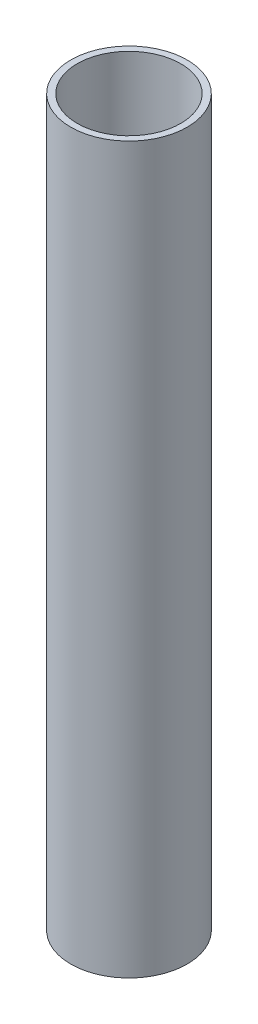
ISO-10303-21;
HEADER;
FILE_DESCRIPTION(('STEP AP214'),'2;1');
FILE_NAME('part.step','',(''),(''),'','','');
FILE_SCHEMA(('AUTOMOTIVE_DESIGN { 1 0 10303 214 1 1 1 1 }'));
ENDSEC;
DATA;
#1=APPLICATION_CONTEXT('core data for automotive mechanical design processes');
#2=APPLICATION_PROTOCOL_DEFINITION('international standard','automotive_design',2000,#1);
#3=PRODUCT_CONTEXT('',#1,'mechanical');
#4=PRODUCT('Part','Part','',(#3));
#5=PRODUCT_RELATED_PRODUCT_CATEGORY('part','',(#4));
#6=PRODUCT_DEFINITION_FORMATION('','',#4);
#7=PRODUCT_DEFINITION_CONTEXT('part definition',#1,'design');
#8=PRODUCT_DEFINITION('design','',#6,#7);
#9=PRODUCT_DEFINITION_SHAPE('','',#8);
#10=(LENGTH_UNIT() NAMED_UNIT(*) SI_UNIT(.MILLI.,.METRE.));
#11=(NAMED_UNIT(*) PLANE_ANGLE_UNIT() SI_UNIT($,.RADIAN.));
#12=(NAMED_UNIT(*) SI_UNIT($,.STERADIAN.) SOLID_ANGLE_UNIT());
#13=UNCERTAINTY_MEASURE_WITH_UNIT(LENGTH_MEASURE(1.E-05),#10,'distance_accuracy_value','');
#14=(GEOMETRIC_REPRESENTATION_CONTEXT(3) GLOBAL_UNCERTAINTY_ASSIGNED_CONTEXT((#13)) GLOBAL_UNIT_ASSIGNED_CONTEXT((#10,
#11,#12)) REPRESENTATION_CONTEXT('',''));
#15=CARTESIAN_POINT('',(0.,0.,0.));
#16=DIRECTION('',(0.,0.,1.));
#17=DIRECTION('',(1.,0.,0.));
#18=AXIS2_PLACEMENT_3D('',#15,#16,#17);
#19=CARTESIAN_POINT('',(0.,711.2,0.));
#20=DIRECTION('',(0.,1.,0.));
#21=DIRECTION('',(0.,0.,1.));
#22=AXIS2_PLACEMENT_3D('',#19,#20,#21);
#23=PLANE('',#22);
#24=CARTESIAN_POINT('',(0.,711.2,0.));
#25=DIRECTION('',(0.,1.,0.));
#26=DIRECTION('',(0.,0.,1.));
#27=AXIS2_PLACEMENT_3D('',#24,#25,#26);
#28=CIRCLE('',#27,57.15);
#29=CARTESIAN_POINT('',(0.,711.2,57.15));
#30=VERTEX_POINT('',#29);
#31=EDGE_CURVE('E10',#30,#30,#28,.T.);
#32=ORIENTED_EDGE('',*,*,#31,.T.);
#33=EDGE_LOOP('',(#32));
#34=FACE_BOUND('',#33,.T.);
#35=CARTESIAN_POINT('',(0.,711.2,0.));
#36=DIRECTION('',(0.,1.,0.));
#37=DIRECTION('',(0.,0.,1.));
#38=AXIS2_PLACEMENT_3D('',#35,#36,#37);
#39=CIRCLE('',#38,50.8);
#40=CARTESIAN_POINT('',(0.,711.2,50.8));
#41=VERTEX_POINT('',#40);
#42=EDGE_CURVE('E42',#41,#41,#39,.T.);
#43=ORIENTED_EDGE('',*,*,#42,.F.);
#44=EDGE_LOOP('',(#43));
#45=FACE_BOUND('',#44,.T.);
#46=ADVANCED_FACE('F31',(#34,#45),#23,.T.);
#47=CARTESIAN_POINT('',(0.,0.,0.));
#48=DIRECTION('',(0.,1.,0.));
#49=DIRECTION('',(0.,0.,1.));
#50=AXIS2_PLACEMENT_3D('',#47,#48,#49);
#51=PLANE('',#50);
#52=CARTESIAN_POINT('',(0.,0.,0.));
#53=DIRECTION('',(0.,1.,0.));
#54=DIRECTION('',(0.,0.,1.));
#55=AXIS2_PLACEMENT_3D('',#52,#53,#54);
#56=CIRCLE('',#55,57.15);
#57=CARTESIAN_POINT('',(0.,0.,57.15));
#58=VERTEX_POINT('',#57);
#59=EDGE_CURVE('E35',#58,#58,#56,.T.);
#60=ORIENTED_EDGE('',*,*,#59,.F.);
#61=EDGE_LOOP('',(#60));
#62=FACE_BOUND('',#61,.T.);
#63=CARTESIAN_POINT('',(0.,0.,0.));
#64=DIRECTION('',(0.,1.,0.));
#65=DIRECTION('',(0.,0.,1.));
#66=AXIS2_PLACEMENT_3D('',#63,#64,#65);
#67=CIRCLE('',#66,50.8);
#68=CARTESIAN_POINT('',(0.,0.,50.8));
#69=VERTEX_POINT('',#68);
#70=EDGE_CURVE('E44',#69,#69,#67,.T.);
#71=ORIENTED_EDGE('',*,*,#70,.T.);
#72=EDGE_LOOP('',(#71));
#73=FACE_BOUND('',#72,.T.);
#74=ADVANCED_FACE('F54',(#62,#73),#51,.F.);
#75=CARTESIAN_POINT('',(0.,711.2,0.));
#76=DIRECTION('',(0.,-1.,0.));
#77=DIRECTION('',(0.,0.,-1.));
#78=AXIS2_PLACEMENT_3D('',#75,#76,#77);
#79=CYLINDRICAL_SURFACE('',#78,57.15);
#80=ORIENTED_EDGE('',*,*,#31,.F.);
#81=EDGE_LOOP('',(#80));
#82=FACE_BOUND('',#81,.T.);
#83=ORIENTED_EDGE('',*,*,#59,.T.);
#84=EDGE_LOOP('',(#83));
#85=FACE_BOUND('',#84,.T.);
#86=ADVANCED_FACE('F33',(#82,#85),#79,.T.);
#87=CARTESIAN_POINT('',(0.,711.2,0.));
#88=DIRECTION('',(0.,-1.,0.));
#89=DIRECTION('',(0.,0.,-1.));
#90=AXIS2_PLACEMENT_3D('',#87,#88,#89);
#91=CYLINDRICAL_SURFACE('',#90,50.8);
#92=ORIENTED_EDGE('',*,*,#42,.T.);
#93=EDGE_LOOP('',(#92));
#94=FACE_BOUND('',#93,.T.);
#95=ORIENTED_EDGE('',*,*,#70,.F.);
#96=EDGE_LOOP('',(#95));
#97=FACE_BOUND('',#96,.T.);
#98=ADVANCED_FACE('F50',(#94,#97),#91,.F.);
#99=CLOSED_SHELL('',(#46,#74,#86,#98));
#100=MANIFOLD_SOLID_BREP('B2',#99);
#101=ADVANCED_BREP_SHAPE_REPRESENTATION('',(#18,#100),#14);
#102=SHAPE_DEFINITION_REPRESENTATION(#9,#101);
ENDSEC;
END-ISO-10303-21;
